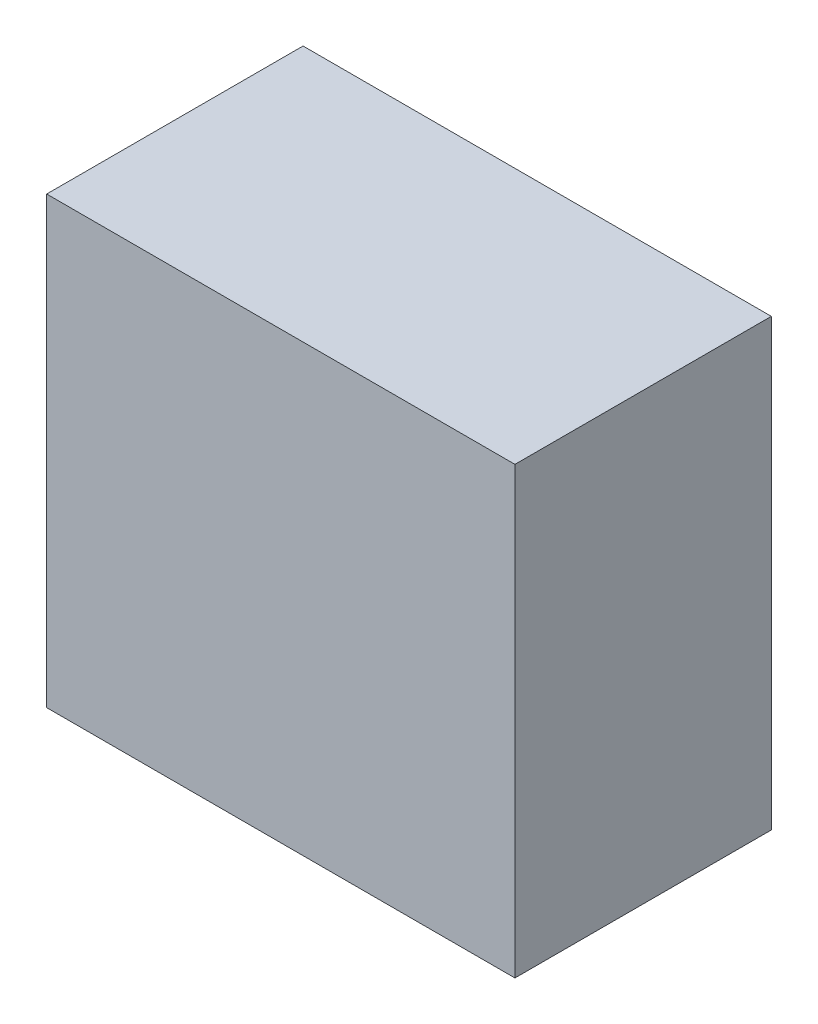
ISO-10303-21;
HEADER;
FILE_DESCRIPTION(('STEP AP214'),'2;1');
FILE_NAME('part.step','',(''),(''),'','','');
FILE_SCHEMA(('AUTOMOTIVE_DESIGN { 1 0 10303 214 1 1 1 1 }'));
ENDSEC;
DATA;
#1=APPLICATION_CONTEXT('core data for automotive mechanical design processes');
#2=APPLICATION_PROTOCOL_DEFINITION('international standard','automotive_design',2000,#1);
#3=PRODUCT_CONTEXT('',#1,'mechanical');
#4=PRODUCT('Part','Part','',(#3));
#5=PRODUCT_RELATED_PRODUCT_CATEGORY('part','',(#4));
#6=PRODUCT_DEFINITION_FORMATION('','',#4);
#7=PRODUCT_DEFINITION_CONTEXT('part definition',#1,'design');
#8=PRODUCT_DEFINITION('design','',#6,#7);
#9=PRODUCT_DEFINITION_SHAPE('','',#8);
#10=(LENGTH_UNIT() NAMED_UNIT(*) SI_UNIT(.MILLI.,.METRE.));
#11=(NAMED_UNIT(*) PLANE_ANGLE_UNIT() SI_UNIT($,.RADIAN.));
#12=(NAMED_UNIT(*) SI_UNIT($,.STERADIAN.) SOLID_ANGLE_UNIT());
#13=UNCERTAINTY_MEASURE_WITH_UNIT(LENGTH_MEASURE(1.E-05),#10,'distance_accuracy_value','');
#14=(GEOMETRIC_REPRESENTATION_CONTEXT(3) GLOBAL_UNCERTAINTY_ASSIGNED_CONTEXT((#13)) GLOBAL_UNIT_ASSIGNED_CONTEXT((#10,
#11,#12)) REPRESENTATION_CONTEXT('',''));
#15=CARTESIAN_POINT('',(0.,0.,0.));
#16=DIRECTION('',(0.,0.,1.));
#17=DIRECTION('',(1.,0.,0.));
#18=AXIS2_PLACEMENT_3D('',#15,#16,#17);
#19=CARTESIAN_POINT('',(2.00000108,-1.89999874,2.1900007));
#20=DIRECTION('',(0.,0.,-1.));
#21=DIRECTION('',(-1.,0.,0.));
#22=AXIS2_PLACEMENT_3D('',#19,#20,#21);
#23=PLANE('',#22);
#24=DIRECTION('',(1.,0.,0.));
#25=VECTOR('',#24,1.);
#26=CARTESIAN_POINT('',(2.00000108,1.89999874,2.1900007));
#27=LINE('',#26,#25);
#28=CARTESIAN_POINT('',(2.00000108,1.89999874,2.1900007));
#29=VERTEX_POINT('',#28);
#30=CARTESIAN_POINT('',(-2.00000108,1.89999874,2.1900007));
#31=VERTEX_POINT('',#30);
#32=EDGE_CURVE('E55',#29,#31,#27,.F.);
#33=ORIENTED_EDGE('',*,*,#32,.T.);
#34=DIRECTION('',(0.,1.,0.));
#35=VECTOR('',#34,1.);
#36=CARTESIAN_POINT('',(-2.00000108,1.89999874,2.1900007));
#37=LINE('',#36,#35);
#38=CARTESIAN_POINT('',(-2.00000108,-1.89999874,2.1900007));
#39=VERTEX_POINT('',#38);
#40=EDGE_CURVE('E57',#31,#39,#37,.F.);
#41=ORIENTED_EDGE('',*,*,#40,.T.);
#42=DIRECTION('',(1.,0.,0.));
#43=VECTOR('',#42,1.);
#44=CARTESIAN_POINT('',(-2.00000108,-1.89999874,2.1900007));
#45=LINE('',#44,#43);
#46=CARTESIAN_POINT('',(2.00000108,-1.89999874,2.1900007));
#47=VERTEX_POINT('',#46);
#48=EDGE_CURVE('E20',#39,#47,#45,.T.);
#49=ORIENTED_EDGE('',*,*,#48,.T.);
#50=DIRECTION('',(0.,1.,0.));
#51=VECTOR('',#50,1.);
#52=CARTESIAN_POINT('',(2.00000108,-1.89999874,2.1900007));
#53=LINE('',#52,#51);
#54=EDGE_CURVE('E80',#47,#29,#53,.T.);
#55=ORIENTED_EDGE('',*,*,#54,.T.);
#56=EDGE_LOOP('',(#33,#41,#49,#55));
#57=FACE_BOUND('',#56,.T.);
#58=ADVANCED_FACE('F17',(#57),#23,.F.);
#59=CARTESIAN_POINT('',(-2.00000108,-1.89999874,0.));
#60=DIRECTION('',(0.,1.,0.));
#61=DIRECTION('',(0.,0.,1.));
#62=AXIS2_PLACEMENT_3D('',#59,#60,#61);
#63=PLANE('',#62);
#64=DIRECTION('',(0.,0.,1.));
#65=VECTOR('',#64,1.);
#66=CARTESIAN_POINT('',(2.00000108,-1.89999874,0.));
#67=LINE('',#66,#65);
#68=CARTESIAN_POINT('',(2.00000108,-1.89999874,0.));
#69=VERTEX_POINT('',#68);
#70=EDGE_CURVE('E68',#69,#47,#67,.T.);
#71=ORIENTED_EDGE('',*,*,#70,.T.);
#72=ORIENTED_EDGE('',*,*,#48,.F.);
#73=DIRECTION('',(0.,0.,-1.));
#74=VECTOR('',#73,1.);
#75=CARTESIAN_POINT('',(-2.00000108,-1.89999874,0.));
#76=LINE('',#75,#74);
#77=CARTESIAN_POINT('',(-2.00000108,-1.89999874,0.));
#78=VERTEX_POINT('',#77);
#79=EDGE_CURVE('E63',#39,#78,#76,.T.);
#80=ORIENTED_EDGE('',*,*,#79,.T.);
#81=DIRECTION('',(-1.,0.,0.));
#82=VECTOR('',#81,1.);
#83=CARTESIAN_POINT('',(2.00000108,-1.89999874,0.));
#84=LINE('',#83,#82);
#85=EDGE_CURVE('E83',#69,#78,#84,.T.);
#86=ORIENTED_EDGE('',*,*,#85,.F.);
#87=EDGE_LOOP('',(#71,#72,#80,#86));
#88=FACE_BOUND('',#87,.T.);
#89=ADVANCED_FACE('F65',(#88),#63,.F.);
#90=CARTESIAN_POINT('',(-2.00000108,1.89999874,0.));
#91=DIRECTION('',(1.,0.,0.));
#92=DIRECTION('',(0.,0.,-1.));
#93=AXIS2_PLACEMENT_3D('',#90,#91,#92);
#94=PLANE('',#93);
#95=ORIENTED_EDGE('',*,*,#79,.F.);
#96=ORIENTED_EDGE('',*,*,#40,.F.);
#97=DIRECTION('',(0.,0.,-1.));
#98=VECTOR('',#97,1.);
#99=CARTESIAN_POINT('',(-2.00000108,1.89999874,0.));
#100=LINE('',#99,#98);
#101=CARTESIAN_POINT('',(-2.00000108,1.89999874,0.));
#102=VERTEX_POINT('',#101);
#103=EDGE_CURVE('E75',#31,#102,#100,.T.);
#104=ORIENTED_EDGE('',*,*,#103,.T.);
#105=DIRECTION('',(0.,1.,0.));
#106=VECTOR('',#105,1.);
#107=CARTESIAN_POINT('',(-2.00000108,-1.89999874,0.));
#108=LINE('',#107,#106);
#109=EDGE_CURVE('E72',#78,#102,#108,.T.);
#110=ORIENTED_EDGE('',*,*,#109,.F.);
#111=EDGE_LOOP('',(#95,#96,#104,#110));
#112=FACE_BOUND('',#111,.T.);
#113=ADVANCED_FACE('F70',(#112),#94,.F.);
#114=CARTESIAN_POINT('',(2.00000108,1.89999874,0.));
#115=DIRECTION('',(0.,-1.,0.));
#116=DIRECTION('',(0.,0.,-1.));
#117=AXIS2_PLACEMENT_3D('',#114,#115,#116);
#118=PLANE('',#117);
#119=ORIENTED_EDGE('',*,*,#103,.F.);
#120=ORIENTED_EDGE('',*,*,#32,.F.);
#121=DIRECTION('',(0.,0.,1.));
#122=VECTOR('',#121,1.);
#123=CARTESIAN_POINT('',(2.00000108,1.89999874,0.));
#124=LINE('',#123,#122);
#125=CARTESIAN_POINT('',(2.00000108,1.89999874,0.));
#126=VERTEX_POINT('',#125);
#127=EDGE_CURVE('E35',#29,#126,#124,.F.);
#128=ORIENTED_EDGE('',*,*,#127,.T.);
#129=DIRECTION('',(-1.,0.,0.));
#130=VECTOR('',#129,1.);
#131=CARTESIAN_POINT('',(2.00000108,1.89999874,0.));
#132=LINE('',#131,#130);
#133=EDGE_CURVE('E26',#102,#126,#132,.F.);
#134=ORIENTED_EDGE('',*,*,#133,.F.);
#135=EDGE_LOOP('',(#119,#120,#128,#134));
#136=FACE_BOUND('',#135,.T.);
#137=ADVANCED_FACE('F89',(#136),#118,.F.);
#138=CARTESIAN_POINT('',(2.00000108,-1.89999874,0.));
#139=DIRECTION('',(-1.,0.,0.));
#140=DIRECTION('',(0.,0.,1.));
#141=AXIS2_PLACEMENT_3D('',#138,#139,#140);
#142=PLANE('',#141);
#143=ORIENTED_EDGE('',*,*,#127,.F.);
#144=ORIENTED_EDGE('',*,*,#54,.F.);
#145=ORIENTED_EDGE('',*,*,#70,.F.);
#146=DIRECTION('',(0.,1.,0.));
#147=VECTOR('',#146,1.);
#148=CARTESIAN_POINT('',(2.00000108,-1.89999874,0.));
#149=LINE('',#148,#147);
#150=EDGE_CURVE('E11',#126,#69,#149,.F.);
#151=ORIENTED_EDGE('',*,*,#150,.F.);
#152=EDGE_LOOP('',(#143,#144,#145,#151));
#153=FACE_BOUND('',#152,.T.);
#154=ADVANCED_FACE('F91',(#153),#142,.F.);
#155=CARTESIAN_POINT('',(2.00000108,-1.89999874,0.));
#156=DIRECTION('',(0.,0.,-1.));
#157=DIRECTION('',(-1.,0.,0.));
#158=AXIS2_PLACEMENT_3D('',#155,#156,#157);
#159=PLANE('',#158);
#160=ORIENTED_EDGE('',*,*,#133,.T.);
#161=ORIENTED_EDGE('',*,*,#150,.T.);
#162=ORIENTED_EDGE('',*,*,#85,.T.);
#163=ORIENTED_EDGE('',*,*,#109,.T.);
#164=EDGE_LOOP('',(#160,#161,#162,#163));
#165=FACE_BOUND('',#164,.T.);
#166=ADVANCED_FACE('F88',(#165),#159,.T.);
#167=CLOSED_SHELL('',(#58,#89,#113,#137,#154,#166));
#168=MANIFOLD_SOLID_BREP('B1',#167);
#169=ADVANCED_BREP_SHAPE_REPRESENTATION('',(#18,#168),#14);
#170=SHAPE_DEFINITION_REPRESENTATION(#9,#169);
ENDSEC;
END-ISO-10303-21;
